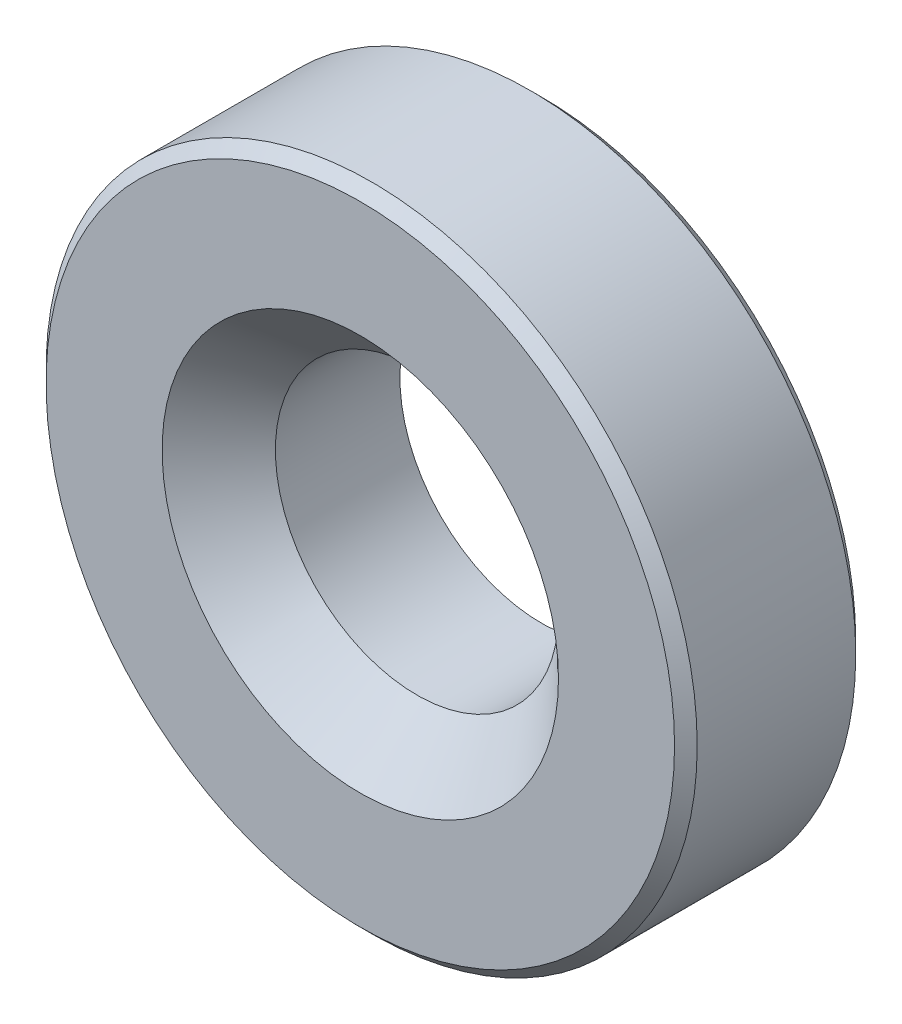
ISO-10303-21;
HEADER;
FILE_DESCRIPTION(('STEP AP214'),'2;1');
FILE_NAME('part.step','',(''),(''),'','','');
FILE_SCHEMA(('AUTOMOTIVE_DESIGN { 1 0 10303 214 1 1 1 1 }'));
ENDSEC;
DATA;
#1=APPLICATION_CONTEXT('core data for automotive mechanical design processes');
#2=APPLICATION_PROTOCOL_DEFINITION('international standard','automotive_design',2000,#1);
#3=PRODUCT_CONTEXT('',#1,'mechanical');
#4=PRODUCT('Part','Part','',(#3));
#5=PRODUCT_RELATED_PRODUCT_CATEGORY('part','',(#4));
#6=PRODUCT_DEFINITION_FORMATION('','',#4);
#7=PRODUCT_DEFINITION_CONTEXT('part definition',#1,'design');
#8=PRODUCT_DEFINITION('design','',#6,#7);
#9=PRODUCT_DEFINITION_SHAPE('','',#8);
#10=(LENGTH_UNIT() NAMED_UNIT(*) SI_UNIT(.MILLI.,.METRE.));
#11=(NAMED_UNIT(*) PLANE_ANGLE_UNIT() SI_UNIT($,.RADIAN.));
#12=(NAMED_UNIT(*) SI_UNIT($,.STERADIAN.) SOLID_ANGLE_UNIT());
#13=UNCERTAINTY_MEASURE_WITH_UNIT(LENGTH_MEASURE(1.E-05),#10,'distance_accuracy_value','');
#14=(GEOMETRIC_REPRESENTATION_CONTEXT(3) GLOBAL_UNCERTAINTY_ASSIGNED_CONTEXT((#13)) GLOBAL_UNIT_ASSIGNED_CONTEXT((#10,
#11,#12)) REPRESENTATION_CONTEXT('',''));
#15=CARTESIAN_POINT('',(0.,0.,0.));
#16=DIRECTION('',(0.,0.,1.));
#17=DIRECTION('',(1.,0.,0.));
#18=AXIS2_PLACEMENT_3D('',#15,#16,#17);
#19=CARTESIAN_POINT('',(0.,0.,16.));
#20=DIRECTION('',(0.,0.,1.));
#21=DIRECTION('',(1.,0.,0.));
#22=AXIS2_PLACEMENT_3D('',#19,#20,#21);
#23=PLANE('',#22);
#24=CARTESIAN_POINT('',(0.,0.,16.));
#25=DIRECTION('',(0.,0.,1.));
#26=DIRECTION('',(1.,0.,0.));
#27=AXIS2_PLACEMENT_3D('',#24,#25,#26);
#28=CIRCLE('',#27,35.);
#29=CARTESIAN_POINT('',(35.,0.,16.));
#30=VERTEX_POINT('',#29);
#31=EDGE_CURVE('E10',#30,#30,#28,.F.);
#32=ORIENTED_EDGE('',*,*,#31,.T.);
#33=EDGE_LOOP('',(#32));
#34=FACE_BOUND('',#33,.T.);
#35=CARTESIAN_POINT('',(0.,0.,16.));
#36=DIRECTION('',(0.,0.,1.));
#37=DIRECTION('',(1.,0.,0.));
#38=AXIS2_PLACEMENT_3D('',#35,#36,#37);
#39=CIRCLE('',#38,55.5);
#40=CARTESIAN_POINT('',(55.5,0.,16.));
#41=VERTEX_POINT('',#40);
#42=EDGE_CURVE('E45',#41,#41,#39,.T.);
#43=ORIENTED_EDGE('',*,*,#42,.T.);
#44=EDGE_LOOP('',(#43));
#45=FACE_BOUND('',#44,.T.);
#46=ADVANCED_FACE('F33',(#34,#45),#23,.T.);
#47=CARTESIAN_POINT('',(0.,0.,-16.));
#48=DIRECTION('',(0.,0.,1.));
#49=DIRECTION('',(1.,0.,0.));
#50=AXIS2_PLACEMENT_3D('',#47,#48,#49);
#51=PLANE('',#50);
#52=CARTESIAN_POINT('',(0.,0.,-16.));
#53=DIRECTION('',(0.,0.,1.));
#54=DIRECTION('',(1.,0.,0.));
#55=AXIS2_PLACEMENT_3D('',#52,#53,#54);
#56=CIRCLE('',#55,55.5);
#57=CARTESIAN_POINT('',(55.5,0.,-16.));
#58=VERTEX_POINT('',#57);
#59=EDGE_CURVE('E49',#58,#58,#56,.F.);
#60=ORIENTED_EDGE('',*,*,#59,.T.);
#61=EDGE_LOOP('',(#60));
#62=FACE_BOUND('',#61,.T.);
#63=CARTESIAN_POINT('',(0.,0.,-16.));
#64=DIRECTION('',(0.,0.,1.));
#65=DIRECTION('',(1.,0.,0.));
#66=AXIS2_PLACEMENT_3D('',#63,#64,#65);
#67=CIRCLE('',#66,25.);
#68=CARTESIAN_POINT('',(25.,0.,-16.));
#69=VERTEX_POINT('',#68);
#70=EDGE_CURVE('E60',#69,#69,#67,.T.);
#71=ORIENTED_EDGE('',*,*,#70,.T.);
#72=EDGE_LOOP('',(#71));
#73=FACE_BOUND('',#72,.T.);
#74=ADVANCED_FACE('F64',(#62,#73),#51,.F.);
#75=CARTESIAN_POINT('',(0.,0.,16.));
#76=DIRECTION('',(0.,0.,-1.));
#77=DIRECTION('',(-1.,0.,0.));
#78=AXIS2_PLACEMENT_3D('',#75,#76,#77);
#79=CYLINDRICAL_SURFACE('',#78,57.5);
#80=CARTESIAN_POINT('',(0.,0.,-14.));
#81=DIRECTION('',(0.,0.,1.));
#82=DIRECTION('',(1.,0.,0.));
#83=AXIS2_PLACEMENT_3D('',#80,#81,#82);
#84=CIRCLE('',#83,57.5);
#85=CARTESIAN_POINT('',(57.5,0.,-14.));
#86=VERTEX_POINT('',#85);
#87=EDGE_CURVE('E54',#86,#86,#84,.T.);
#88=ORIENTED_EDGE('',*,*,#87,.T.);
#89=EDGE_LOOP('',(#88));
#90=FACE_BOUND('',#89,.T.);
#91=CARTESIAN_POINT('',(0.,0.,14.));
#92=DIRECTION('',(0.,0.,1.));
#93=DIRECTION('',(1.,0.,0.));
#94=AXIS2_PLACEMENT_3D('',#91,#92,#93);
#95=CIRCLE('',#94,57.5);
#96=CARTESIAN_POINT('',(57.5,0.,14.));
#97=VERTEX_POINT('',#96);
#98=EDGE_CURVE('E57',#97,#97,#95,.F.);
#99=ORIENTED_EDGE('',*,*,#98,.T.);
#100=EDGE_LOOP('',(#99));
#101=FACE_BOUND('',#100,.T.);
#102=ADVANCED_FACE('F69',(#90,#101),#79,.T.);
#103=CARTESIAN_POINT('',(0.,0.,16.));
#104=DIRECTION('',(0.,0.,-1.));
#105=DIRECTION('',(-1.,0.,0.));
#106=AXIS2_PLACEMENT_3D('',#103,#104,#105);
#107=CYLINDRICAL_SURFACE('',#106,25.);
#108=CARTESIAN_POINT('',(0.,0.,5.99999999999999));
#109=DIRECTION('',(0.,0.,1.));
#110=DIRECTION('',(1.,0.,0.));
#111=AXIS2_PLACEMENT_3D('',#108,#109,#110);
#112=CIRCLE('',#111,25.);
#113=CARTESIAN_POINT('',(25.,0.,5.99999999999999));
#114=VERTEX_POINT('',#113);
#115=EDGE_CURVE('E41',#114,#114,#112,.T.);
#116=ORIENTED_EDGE('',*,*,#115,.T.);
#117=EDGE_LOOP('',(#116));
#118=FACE_BOUND('',#117,.T.);
#119=ORIENTED_EDGE('',*,*,#70,.F.);
#120=EDGE_LOOP('',(#119));
#121=FACE_BOUND('',#120,.T.);
#122=ADVANCED_FACE('F66',(#118,#121),#107,.F.);
#123=CARTESIAN_POINT('',(0.,0.,-14.));
#124=DIRECTION('',(0.,0.,1.));
#125=DIRECTION('',(1.,0.,0.));
#126=AXIS2_PLACEMENT_3D('',#123,#124,#125);
#127=CONICAL_SURFACE('',#126,57.5,0.78539816339745);
#128=ORIENTED_EDGE('',*,*,#59,.F.);
#129=EDGE_LOOP('',(#128));
#130=FACE_BOUND('',#129,.T.);
#131=ORIENTED_EDGE('',*,*,#87,.F.);
#132=EDGE_LOOP('',(#131));
#133=FACE_BOUND('',#132,.T.);
#134=ADVANCED_FACE('F68',(#130,#133),#127,.T.);
#135=CARTESIAN_POINT('',(0.,0.,16.));
#136=DIRECTION('',(0.,0.,-1.));
#137=DIRECTION('',(-1.,0.,0.));
#138=AXIS2_PLACEMENT_3D('',#135,#136,#137);
#139=CONICAL_SURFACE('',#138,55.5,0.785398163397448);
#140=ORIENTED_EDGE('',*,*,#98,.F.);
#141=EDGE_LOOP('',(#140));
#142=FACE_BOUND('',#141,.T.);
#143=ORIENTED_EDGE('',*,*,#42,.F.);
#144=EDGE_LOOP('',(#143));
#145=FACE_BOUND('',#144,.T.);
#146=ADVANCED_FACE('F75',(#142,#145),#139,.T.);
#147=CARTESIAN_POINT('',(0.,0.,5.99999999999999));
#148=DIRECTION('',(0.,0.,1.));
#149=DIRECTION('',(1.,0.,0.));
#150=AXIS2_PLACEMENT_3D('',#147,#148,#149);
#151=CONICAL_SURFACE('',#150,25.,0.78539816339745);
#152=ORIENTED_EDGE('',*,*,#31,.F.);
#153=EDGE_LOOP('',(#152));
#154=FACE_BOUND('',#153,.T.);
#155=ORIENTED_EDGE('',*,*,#115,.F.);
#156=EDGE_LOOP('',(#155));
#157=FACE_BOUND('',#156,.T.);
#158=ADVANCED_FACE('F36',(#154,#157),#151,.F.);
#159=CLOSED_SHELL('',(#46,#74,#102,#122,#134,#146,#158));
#160=MANIFOLD_SOLID_BREP('B2',#159);
#161=ADVANCED_BREP_SHAPE_REPRESENTATION('',(#18,#160),#14);
#162=SHAPE_DEFINITION_REPRESENTATION(#9,#161);
ENDSEC;
END-ISO-10303-21;
